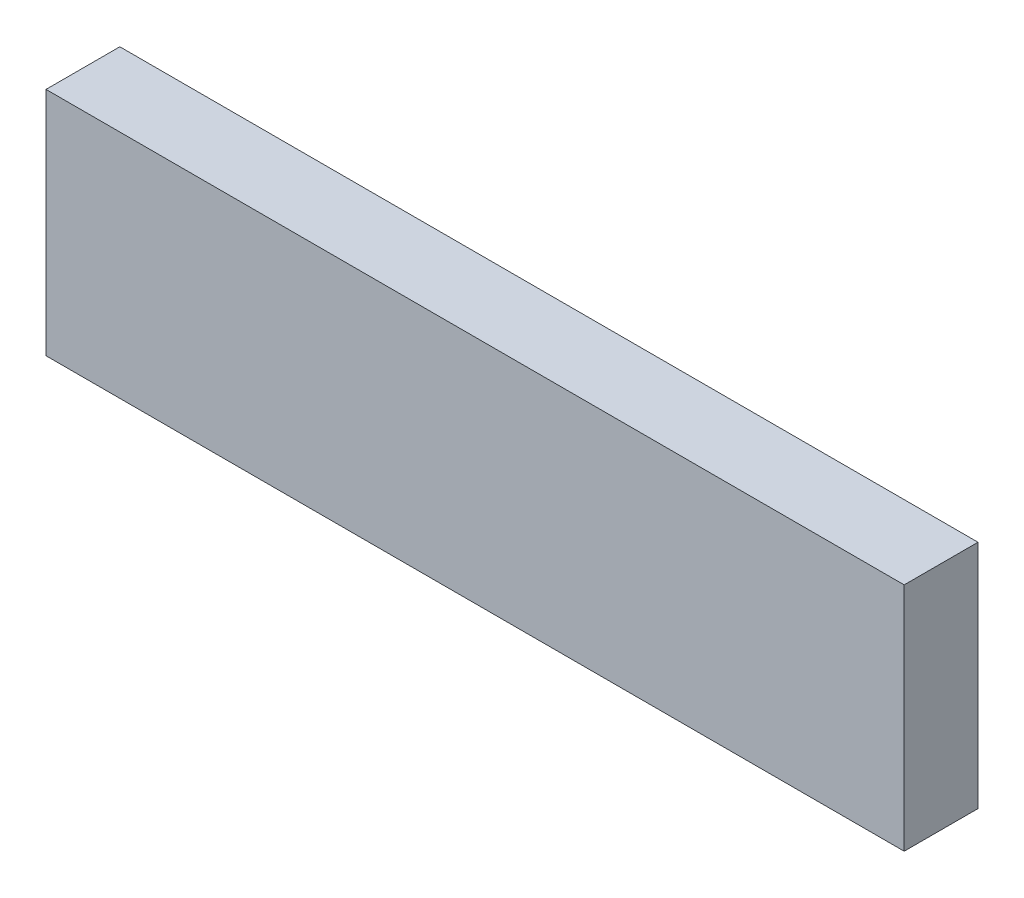
ISO-10303-21;
HEADER;
FILE_DESCRIPTION(('STEP AP214'),'2;1');
FILE_NAME('part.step','',(''),(''),'','','');
FILE_SCHEMA(('AUTOMOTIVE_DESIGN { 1 0 10303 214 1 1 1 1 }'));
ENDSEC;
DATA;
#1=APPLICATION_CONTEXT('core data for automotive mechanical design processes');
#2=APPLICATION_PROTOCOL_DEFINITION('international standard','automotive_design',2000,#1);
#3=PRODUCT_CONTEXT('',#1,'mechanical');
#4=PRODUCT('Part','Part','',(#3));
#5=PRODUCT_RELATED_PRODUCT_CATEGORY('part','',(#4));
#6=PRODUCT_DEFINITION_FORMATION('','',#4);
#7=PRODUCT_DEFINITION_CONTEXT('part definition',#1,'design');
#8=PRODUCT_DEFINITION('design','',#6,#7);
#9=PRODUCT_DEFINITION_SHAPE('','',#8);
#10=(LENGTH_UNIT() NAMED_UNIT(*) SI_UNIT(.MILLI.,.METRE.));
#11=(NAMED_UNIT(*) PLANE_ANGLE_UNIT() SI_UNIT($,.RADIAN.));
#12=(NAMED_UNIT(*) SI_UNIT($,.STERADIAN.) SOLID_ANGLE_UNIT());
#13=UNCERTAINTY_MEASURE_WITH_UNIT(LENGTH_MEASURE(1.E-05),#10,'distance_accuracy_value','');
#14=(GEOMETRIC_REPRESENTATION_CONTEXT(3) GLOBAL_UNCERTAINTY_ASSIGNED_CONTEXT((#13)) GLOBAL_UNIT_ASSIGNED_CONTEXT((#10,
#11,#12)) REPRESENTATION_CONTEXT('',''));
#15=CARTESIAN_POINT('',(0.,0.,0.));
#16=DIRECTION('',(0.,0.,1.));
#17=DIRECTION('',(1.,0.,0.));
#18=AXIS2_PLACEMENT_3D('',#15,#16,#17);
#19=CARTESIAN_POINT('',(0.,25.,8.));
#20=DIRECTION('',(1.,0.,0.));
#21=DIRECTION('',(0.,0.,-1.));
#22=AXIS2_PLACEMENT_3D('',#19,#20,#21);
#23=PLANE('',#22);
#24=DIRECTION('',(0.,-1.,0.));
#25=VECTOR('',#24,1.);
#26=CARTESIAN_POINT('',(0.,25.,0.));
#27=LINE('',#26,#25);
#28=CARTESIAN_POINT('',(0.,25.,0.));
#29=VERTEX_POINT('',#28);
#30=CARTESIAN_POINT('',(0.,0.,0.));
#31=VERTEX_POINT('',#30);
#32=EDGE_CURVE('E99',#29,#31,#27,.T.);
#33=ORIENTED_EDGE('',*,*,#32,.T.);
#34=DIRECTION('',(0.,0.,-1.));
#35=VECTOR('',#34,1.);
#36=CARTESIAN_POINT('',(0.,0.,8.));
#37=LINE('',#36,#35);
#38=CARTESIAN_POINT('',(0.,0.,8.));
#39=VERTEX_POINT('',#38);
#40=EDGE_CURVE('E11',#39,#31,#37,.T.);
#41=ORIENTED_EDGE('',*,*,#40,.F.);
#42=DIRECTION('',(0.,-1.,0.));
#43=VECTOR('',#42,1.);
#44=CARTESIAN_POINT('',(0.,25.,8.));
#45=LINE('',#44,#43);
#46=CARTESIAN_POINT('',(0.,25.,8.));
#47=VERTEX_POINT('',#46);
#48=EDGE_CURVE('E87',#47,#39,#45,.T.);
#49=ORIENTED_EDGE('',*,*,#48,.F.);
#50=DIRECTION('',(0.,0.,-1.));
#51=VECTOR('',#50,1.);
#52=CARTESIAN_POINT('',(0.,25.,8.));
#53=LINE('',#52,#51);
#54=EDGE_CURVE('E95',#47,#29,#53,.T.);
#55=ORIENTED_EDGE('',*,*,#54,.T.);
#56=EDGE_LOOP('',(#33,#41,#49,#55));
#57=FACE_BOUND('',#56,.T.);
#58=ADVANCED_FACE('F36',(#57),#23,.F.);
#59=CARTESIAN_POINT('',(0.,0.,8.));
#60=DIRECTION('',(0.,1.,0.));
#61=DIRECTION('',(0.,0.,1.));
#62=AXIS2_PLACEMENT_3D('',#59,#60,#61);
#63=PLANE('',#62);
#64=DIRECTION('',(1.,0.,0.));
#65=VECTOR('',#64,1.);
#66=CARTESIAN_POINT('',(0.,0.,0.));
#67=LINE('',#66,#65);
#68=CARTESIAN_POINT('',(93.,0.,0.));
#69=VERTEX_POINT('',#68);
#70=EDGE_CURVE('E91',#31,#69,#67,.T.);
#71=ORIENTED_EDGE('',*,*,#70,.T.);
#72=DIRECTION('',(0.,0.,-1.));
#73=VECTOR('',#72,1.);
#74=CARTESIAN_POINT('',(93.,0.,8.));
#75=LINE('',#74,#73);
#76=CARTESIAN_POINT('',(93.,0.,8.));
#77=VERTEX_POINT('',#76);
#78=EDGE_CURVE('E44',#77,#69,#75,.T.);
#79=ORIENTED_EDGE('',*,*,#78,.F.);
#80=DIRECTION('',(1.,0.,0.));
#81=VECTOR('',#80,1.);
#82=CARTESIAN_POINT('',(0.,0.,8.));
#83=LINE('',#82,#81);
#84=EDGE_CURVE('E82',#39,#77,#83,.T.);
#85=ORIENTED_EDGE('',*,*,#84,.F.);
#86=ORIENTED_EDGE('',*,*,#40,.T.);
#87=EDGE_LOOP('',(#71,#79,#85,#86));
#88=FACE_BOUND('',#87,.T.);
#89=ADVANCED_FACE('F90',(#88),#63,.F.);
#90=CARTESIAN_POINT('',(93.,0.,8.));
#91=DIRECTION('',(-1.,0.,0.));
#92=DIRECTION('',(0.,0.,1.));
#93=AXIS2_PLACEMENT_3D('',#90,#91,#92);
#94=PLANE('',#93);
#95=DIRECTION('',(0.,1.,0.));
#96=VECTOR('',#95,1.);
#97=CARTESIAN_POINT('',(93.,0.,0.));
#98=LINE('',#97,#96);
#99=CARTESIAN_POINT('',(93.,25.,0.));
#100=VERTEX_POINT('',#99);
#101=EDGE_CURVE('E69',#69,#100,#98,.T.);
#102=ORIENTED_EDGE('',*,*,#101,.T.);
#103=DIRECTION('',(0.,0.,-1.));
#104=VECTOR('',#103,1.);
#105=CARTESIAN_POINT('',(93.,25.,8.));
#106=LINE('',#105,#104);
#107=CARTESIAN_POINT('',(93.,25.,8.));
#108=VERTEX_POINT('',#107);
#109=EDGE_CURVE('E92',#108,#100,#106,.T.);
#110=ORIENTED_EDGE('',*,*,#109,.F.);
#111=DIRECTION('',(0.,1.,0.));
#112=VECTOR('',#111,1.);
#113=CARTESIAN_POINT('',(93.,0.,8.));
#114=LINE('',#113,#112);
#115=EDGE_CURVE('E85',#77,#108,#114,.T.);
#116=ORIENTED_EDGE('',*,*,#115,.F.);
#117=ORIENTED_EDGE('',*,*,#78,.T.);
#118=EDGE_LOOP('',(#102,#110,#116,#117));
#119=FACE_BOUND('',#118,.T.);
#120=ADVANCED_FACE('F93',(#119),#94,.F.);
#121=CARTESIAN_POINT('',(93.,25.,8.));
#122=DIRECTION('',(0.,-1.,0.));
#123=DIRECTION('',(1.,0.,0.));
#124=AXIS2_PLACEMENT_3D('',#121,#122,#123);
#125=PLANE('',#124);
#126=DIRECTION('',(-1.,0.,0.));
#127=VECTOR('',#126,1.);
#128=CARTESIAN_POINT('',(93.,25.,0.));
#129=LINE('',#128,#127);
#130=EDGE_CURVE('E75',#100,#29,#129,.T.);
#131=ORIENTED_EDGE('',*,*,#130,.T.);
#132=ORIENTED_EDGE('',*,*,#54,.F.);
#133=DIRECTION('',(-1.,0.,0.));
#134=VECTOR('',#133,1.);
#135=CARTESIAN_POINT('',(93.,25.,8.));
#136=LINE('',#135,#134);
#137=EDGE_CURVE('E52',#108,#47,#136,.T.);
#138=ORIENTED_EDGE('',*,*,#137,.F.);
#139=ORIENTED_EDGE('',*,*,#109,.T.);
#140=EDGE_LOOP('',(#131,#132,#138,#139));
#141=FACE_BOUND('',#140,.T.);
#142=ADVANCED_FACE('F106',(#141),#125,.F.);
#143=CARTESIAN_POINT('',(0.,0.,8.));
#144=DIRECTION('',(0.,0.,1.));
#145=DIRECTION('',(1.,0.,0.));
#146=AXIS2_PLACEMENT_3D('',#143,#144,#145);
#147=PLANE('',#146);
#148=ORIENTED_EDGE('',*,*,#48,.T.);
#149=ORIENTED_EDGE('',*,*,#84,.T.);
#150=ORIENTED_EDGE('',*,*,#115,.T.);
#151=ORIENTED_EDGE('',*,*,#137,.T.);
#152=EDGE_LOOP('',(#148,#149,#150,#151));
#153=FACE_BOUND('',#152,.T.);
#154=ADVANCED_FACE('F83',(#153),#147,.T.);
#155=CARTESIAN_POINT('',(0.,0.,0.));
#156=DIRECTION('',(0.,0.,1.));
#157=DIRECTION('',(1.,0.,0.));
#158=AXIS2_PLACEMENT_3D('',#155,#156,#157);
#159=PLANE('',#158);
#160=ORIENTED_EDGE('',*,*,#32,.F.);
#161=ORIENTED_EDGE('',*,*,#130,.F.);
#162=ORIENTED_EDGE('',*,*,#101,.F.);
#163=ORIENTED_EDGE('',*,*,#70,.F.);
#164=EDGE_LOOP('',(#160,#161,#162,#163));
#165=FACE_BOUND('',#164,.T.);
#166=ADVANCED_FACE('F109',(#165),#159,.F.);
#167=CLOSED_SHELL('',(#58,#89,#120,#142,#154,#166));
#168=MANIFOLD_SOLID_BREP('B2',#167);
#169=ADVANCED_BREP_SHAPE_REPRESENTATION('',(#18,#168),#14);
#170=SHAPE_DEFINITION_REPRESENTATION(#9,#169);
ENDSEC;
END-ISO-10303-21;
